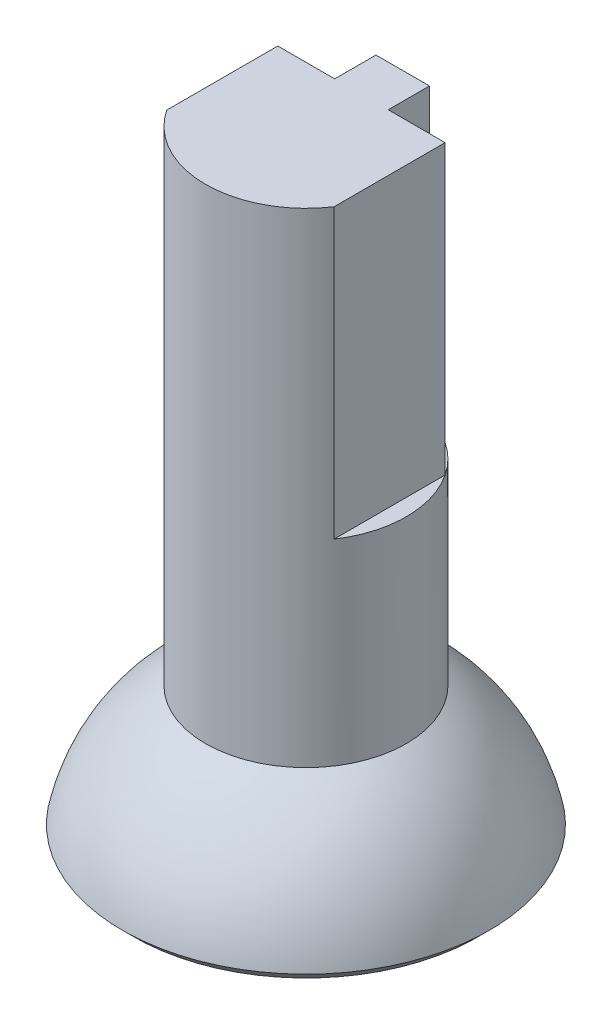
ISO-10303-21;
HEADER;
FILE_DESCRIPTION(('STEP AP214'),'2;1');
FILE_NAME('part.step','',(''),(''),'','','');
FILE_SCHEMA(('AUTOMOTIVE_DESIGN { 1 0 10303 214 1 1 1 1 }'));
ENDSEC;
DATA;
#1=APPLICATION_CONTEXT('core data for automotive mechanical design processes');
#2=APPLICATION_PROTOCOL_DEFINITION('international standard','automotive_design',2000,#1);
#3=PRODUCT_CONTEXT('',#1,'mechanical');
#4=PRODUCT('Part','Part','',(#3));
#5=PRODUCT_RELATED_PRODUCT_CATEGORY('part','',(#4));
#6=PRODUCT_DEFINITION_FORMATION('','',#4);
#7=PRODUCT_DEFINITION_CONTEXT('part definition',#1,'design');
#8=PRODUCT_DEFINITION('design','',#6,#7);
#9=PRODUCT_DEFINITION_SHAPE('','',#8);
#10=(LENGTH_UNIT() NAMED_UNIT(*) SI_UNIT(.MILLI.,.METRE.));
#11=(NAMED_UNIT(*) PLANE_ANGLE_UNIT() SI_UNIT($,.RADIAN.));
#12=(NAMED_UNIT(*) SI_UNIT($,.STERADIAN.) SOLID_ANGLE_UNIT());
#13=UNCERTAINTY_MEASURE_WITH_UNIT(LENGTH_MEASURE(1.E-05),#10,'distance_accuracy_value','');
#14=(GEOMETRIC_REPRESENTATION_CONTEXT(3) GLOBAL_UNCERTAINTY_ASSIGNED_CONTEXT((#13)) GLOBAL_UNIT_ASSIGNED_CONTEXT((#10,
#11,#12)) REPRESENTATION_CONTEXT('',''));
#15=CARTESIAN_POINT('',(0.,0.,0.));
#16=DIRECTION('',(0.,0.,1.));
#17=DIRECTION('',(1.,0.,0.));
#18=AXIS2_PLACEMENT_3D('',#15,#16,#17);
#19=CARTESIAN_POINT('',(0.,12.192,0.));
#20=DIRECTION('',(0.,-1.,0.));
#21=DIRECTION('',(1.,0.,0.));
#22=AXIS2_PLACEMENT_3D('',#19,#20,#21);
#23=PLANE('',#22);
#24=DIRECTION('',(0.,0.,1.));
#25=VECTOR('',#24,1.);
#26=CARTESIAN_POINT('',(-1.5875,12.192,0.));
#27=LINE('',#26,#25);
#28=CARTESIAN_POINT('',(-1.5875,12.192,-1.05302837093784));
#29=VERTEX_POINT('',#28);
#30=CARTESIAN_POINT('',(-1.5875,12.192,1.05302837093784));
#31=VERTEX_POINT('',#30);
#32=EDGE_CURVE('E248',#29,#31,#27,.T.);
#33=ORIENTED_EDGE('',*,*,#32,.T.);
#34=CARTESIAN_POINT('',(0.,12.192,0.));
#35=DIRECTION('',(0.,1.,0.));
#36=DIRECTION('',(-1.,0.,0.));
#37=AXIS2_PLACEMENT_3D('',#34,#35,#36);
#38=CIRCLE('',#37,1.905);
#39=CARTESIAN_POINT('',(1.5875,12.192,1.05302837093784));
#40=VERTEX_POINT('',#39);
#41=EDGE_CURVE('E228',#31,#40,#38,.T.);
#42=ORIENTED_EDGE('',*,*,#41,.T.);
#43=DIRECTION('',(0.,0.,1.));
#44=VECTOR('',#43,1.);
#45=CARTESIAN_POINT('',(1.5875,12.192,0.));
#46=LINE('',#45,#44);
#47=CARTESIAN_POINT('',(1.5875,12.192,-1.05302837093784));
#48=VERTEX_POINT('',#47);
#49=EDGE_CURVE('E245',#48,#40,#46,.T.);
#50=ORIENTED_EDGE('',*,*,#49,.F.);
#51=DIRECTION('',(1.,0.,0.));
#52=VECTOR('',#51,1.);
#53=CARTESIAN_POINT('',(0.,12.192,-1.05302837093784));
#54=LINE('',#53,#52);
#55=CARTESIAN_POINT('',(0.507999999999998,12.192,-1.05302837093784));
#56=VERTEX_POINT('',#55);
#57=EDGE_CURVE('E256',#56,#48,#54,.T.);
#58=ORIENTED_EDGE('',*,*,#57,.F.);
#59=DIRECTION('',(0.,0.,1.));
#60=VECTOR('',#59,1.);
#61=CARTESIAN_POINT('',(0.507999999999999,12.192,0.));
#62=LINE('',#61,#60);
#63=CARTESIAN_POINT('',(0.508,12.192,-1.83601770143972));
#64=VERTEX_POINT('',#63);
#65=EDGE_CURVE('E262',#64,#56,#62,.T.);
#66=ORIENTED_EDGE('',*,*,#65,.F.);
#67=DIRECTION('',(1.,0.,0.));
#68=VECTOR('',#67,1.);
#69=CARTESIAN_POINT('',(0.,12.192,-1.83601770143972));
#70=LINE('',#69,#68);
#71=CARTESIAN_POINT('',(-0.508,12.192,-1.83601770143972));
#72=VERTEX_POINT('',#71);
#73=EDGE_CURVE('E140',#72,#64,#70,.T.);
#74=ORIENTED_EDGE('',*,*,#73,.F.);
#75=DIRECTION('',(0.,0.,1.));
#76=VECTOR('',#75,1.);
#77=CARTESIAN_POINT('',(-0.508000000000001,12.192,0.));
#78=LINE('',#77,#76);
#79=CARTESIAN_POINT('',(-0.508000000000002,12.192,-1.05302837093784));
#80=VERTEX_POINT('',#79);
#81=EDGE_CURVE('E155',#72,#80,#78,.T.);
#82=ORIENTED_EDGE('',*,*,#81,.T.);
#83=DIRECTION('',(-1.,0.,0.));
#84=VECTOR('',#83,1.);
#85=CARTESIAN_POINT('',(0.,12.192,-1.05302837093784));
#86=LINE('',#85,#84);
#87=EDGE_CURVE('E260',#80,#29,#86,.T.);
#88=ORIENTED_EDGE('',*,*,#87,.T.);
#89=EDGE_LOOP('',(#33,#42,#50,#58,#66,#74,#82,#88));
#90=FACE_BOUND('',#89,.T.);
#91=ADVANCED_FACE('F49',(#90),#23,.F.);
#92=CARTESIAN_POINT('',(0.,12.192,0.));
#93=DIRECTION('',(0.,1.,0.));
#94=DIRECTION('',(-1.,0.,0.));
#95=AXIS2_PLACEMENT_3D('',#92,#93,#94);
#96=CYLINDRICAL_SURFACE('',#95,1.905);
#97=CARTESIAN_POINT('',(0.,3.00268396605437,0.));
#98=DIRECTION('',(0.,1.,0.));
#99=DIRECTION('',(-1.,0.,0.));
#100=AXIS2_PLACEMENT_3D('',#97,#98,#99);
#101=CIRCLE('',#100,1.905);
#102=CARTESIAN_POINT('',(-1.905,3.00268396605437,0.));
#103=VERTEX_POINT('',#102);
#104=EDGE_CURVE('E222',#103,#103,#101,.T.);
#105=ORIENTED_EDGE('',*,*,#104,.T.);
#106=EDGE_LOOP('',(#105));
#107=FACE_BOUND('',#106,.T.);
#108=ORIENTED_EDGE('',*,*,#41,.F.);
#109=DIRECTION('',(0.,1.,0.));
#110=VECTOR('',#109,1.);
#111=CARTESIAN_POINT('',(-1.5875,12.192,1.05302837093784));
#112=LINE('',#111,#110);
#113=CARTESIAN_POINT('',(-1.5875,6.731,1.05302837093784));
#114=VERTEX_POINT('',#113);
#115=EDGE_CURVE('E172',#31,#114,#112,.F.);
#116=ORIENTED_EDGE('',*,*,#115,.T.);
#117=CARTESIAN_POINT('',(0.,6.731,0.));
#118=DIRECTION('',(0.,1.,0.));
#119=DIRECTION('',(0.,0.,1.));
#120=AXIS2_PLACEMENT_3D('',#117,#118,#119);
#121=CIRCLE('',#120,1.905);
#122=CARTESIAN_POINT('',(-1.5875,6.731,-1.05302837093784));
#123=VERTEX_POINT('',#122);
#124=EDGE_CURVE('E163',#114,#123,#121,.F.);
#125=ORIENTED_EDGE('',*,*,#124,.T.);
#126=CARTESIAN_POINT('',(-0.507999999999999,6.731,-1.83601770143972));
#127=VERTEX_POINT('',#126);
#128=EDGE_CURVE('E160',#123,#127,#121,.F.);
#129=ORIENTED_EDGE('',*,*,#128,.T.);
#130=CARTESIAN_POINT('',(0.508000000000001,6.731,-1.83601770143972));
#131=VERTEX_POINT('',#130);
#132=EDGE_CURVE('E128',#127,#131,#121,.F.);
#133=ORIENTED_EDGE('',*,*,#132,.T.);
#134=CARTESIAN_POINT('',(1.5875,6.731,-1.05302837093784));
#135=VERTEX_POINT('',#134);
#136=EDGE_CURVE('E117',#131,#135,#121,.F.);
#137=ORIENTED_EDGE('',*,*,#136,.T.);
#138=CARTESIAN_POINT('',(1.5875,6.731,1.05302837093784));
#139=VERTEX_POINT('',#138);
#140=EDGE_CURVE('E129',#135,#139,#121,.F.);
#141=ORIENTED_EDGE('',*,*,#140,.T.);
#142=DIRECTION('',(0.,1.,0.));
#143=VECTOR('',#142,1.);
#144=CARTESIAN_POINT('',(1.5875,12.192,1.05302837093784));
#145=LINE('',#144,#143);
#146=EDGE_CURVE('E169',#40,#139,#145,.F.);
#147=ORIENTED_EDGE('',*,*,#146,.F.);
#148=EDGE_LOOP('',(#108,#116,#125,#129,#133,#137,#141,#147));
#149=FACE_BOUND('',#148,.T.);
#150=ADVANCED_FACE('F158',(#107,#149),#96,.T.);
#151=CARTESIAN_POINT('',(0.,0.508,0.));
#152=DIRECTION('',(0.,-1.,0.));
#153=DIRECTION('',(1.,0.,0.));
#154=AXIS2_PLACEMENT_3D('',#151,#152,#153);
#155=CONICAL_SURFACE('',#154,2.63964543073497,0.5235987755983);
#156=CARTESIAN_POINT('',(0.,1.27,0.));
#157=DIRECTION('',(0.,1.,0.));
#158=DIRECTION('',(-1.,0.,0.));
#159=AXIS2_PLACEMENT_3D('',#156,#157,#158);
#160=CIRCLE('',#159,2.19970452561247);
#161=CARTESIAN_POINT('',(-2.19970452561247,1.27,0.));
#162=VERTEX_POINT('',#161);
#163=EDGE_CURVE('E167',#162,#162,#160,.T.);
#164=ORIENTED_EDGE('',*,*,#163,.T.);
#165=EDGE_LOOP('',(#164));
#166=FACE_BOUND('',#165,.T.);
#167=CARTESIAN_POINT('',(0.,0.508,0.));
#168=DIRECTION('',(0.,1.,0.));
#169=DIRECTION('',(-1.,0.,0.));
#170=AXIS2_PLACEMENT_3D('',#167,#168,#169);
#171=CIRCLE('',#170,2.63964543073497);
#172=CARTESIAN_POINT('',(-2.63964543073497,0.507999999999999,0.));
#173=VERTEX_POINT('',#172);
#174=EDGE_CURVE('E219',#173,#173,#171,.T.);
#175=ORIENTED_EDGE('',*,*,#174,.F.);
#176=EDGE_LOOP('',(#175));
#177=FACE_BOUND('',#176,.T.);
#178=ADVANCED_FACE('F199',(#166,#177),#155,.F.);
#179=CARTESIAN_POINT('',(0.,0.,0.));
#180=DIRECTION('',(0.,1.,0.));
#181=DIRECTION('',(-1.,0.,0.));
#182=AXIS2_PLACEMENT_3D('',#179,#180,#181);
#183=SPHERICAL_SURFACE('',#182,2.54);
#184=CARTESIAN_POINT('',(0.,2.19970452561248,0.));
#185=DIRECTION('',(0.,1.,0.));
#186=DIRECTION('',(-1.,0.,0.));
#187=AXIS2_PLACEMENT_3D('',#184,#185,#186);
#188=CIRCLE('',#187,1.27);
#189=CARTESIAN_POINT('',(-1.27,2.19970452561248,0.));
#190=VERTEX_POINT('',#189);
#191=EDGE_CURVE('E236',#190,#190,#188,.T.);
#192=CARTESIAN_POINT('',(-1.27,2.19970452561248,0.));
#193=CARTESIAN_POINT('',(-1.28199753264214,2.19277775949318,0.));
#194=CARTESIAN_POINT('',(-1.29393838476726,2.18575282045622,0.));
#195=CARTESIAN_POINT('',(-1.31770355573429,2.17150851834517,0.));
#196=CARTESIAN_POINT('',(-1.3295278745762,2.16428915527108,0.));
#197=CARTESIAN_POINT('',(-1.35305680672766,2.14965792688395,0.));
#198=CARTESIAN_POINT('',(-1.3647614200372,2.1422460615709,0.));
#199=CARTESIAN_POINT('',(-1.38804780928253,2.12723181598885,0.));
#200=CARTESIAN_POINT('',(-1.39962958521831,2.11962943571983,0.));
#201=CARTESIAN_POINT('',(-1.42266719852126,2.1042361947771,0.));
#202=CARTESIAN_POINT('',(-1.43412303588844,2.09644533410339,0.));
#203=CARTESIAN_POINT('',(-1.45690570517635,2.08067721836467,0.));
#204=CARTESIAN_POINT('',(-1.46823253709709,2.07269996329967,0.));
#205=CARTESIAN_POINT('',(-1.49075416299134,2.05656119442574,0.));
#206=CARTESIAN_POINT('',(-1.50194895696485,2.04839968061682,0.));
#207=CARTESIAN_POINT('',(-1.52420350985671,2.03189457930486,0.));
#208=CARTESIAN_POINT('',(-1.53526326877505,2.02355099180182,0.));
#209=CARTESIAN_POINT('',(-1.55724479058924,2.00668397687767,0.));
#210=CARTESIAN_POINT('',(-1.56816655348509,1.99816054945656,0.));
#211=CARTESIAN_POINT('',(-1.5898691592349,1.98093613662499,0.));
#212=CARTESIAN_POINT('',(-1.60065000208887,1.97223515121454,0.));
#213=CARTESIAN_POINT('',(-1.62206788146244,1.95465795186817,0.));
#214=CARTESIAN_POINT('',(-1.63270491798204,1.94578173793227,0.));
#215=CARTESIAN_POINT('',(-1.65383233689503,1.92785645791219,0.));
#216=CARTESIAN_POINT('',(-1.66432271928842,1.91880739182802,0.));
#217=CARTESIAN_POINT('',(-1.68515402141993,1.90053883016519,0.));
#218=CARTESIAN_POINT('',(-1.69549494115806,1.89131933458654,0.));
#219=CARTESIAN_POINT('',(-1.71602454946479,1.87271238221666,0.));
#220=CARTESIAN_POINT('',(-1.7262132380334,1.86332492542543,0.));
#221=CARTESIAN_POINT('',(-1.74643565624278,1.84438456387958,0.));
#222=CARTESIAN_POINT('',(-1.75646938588357,1.83483165912496,0.));
#223=CARTESIAN_POINT('',(-1.77637919996526,1.81556295919592,0.));
#224=CARTESIAN_POINT('',(-1.78625528440617,1.8058471640215,0.));
#225=CARTESIAN_POINT('',(-1.80584716402149,1.78625528440617,0.));
#226=CARTESIAN_POINT('',(-1.81556295919591,1.77637919996526,0.));
#227=CARTESIAN_POINT('',(-1.83483165912495,1.75646938588357,0.));
#228=CARTESIAN_POINT('',(-1.84438456387958,1.74643565624279,0.));
#229=CARTESIAN_POINT('',(-1.86332492542543,1.7262132380334,0.));
#230=CARTESIAN_POINT('',(-1.87271238221665,1.7160245494648,0.));
#231=CARTESIAN_POINT('',(-1.89131933458653,1.69549494115806,0.));
#232=CARTESIAN_POINT('',(-1.90053883016519,1.68515402141993,0.));
#233=CARTESIAN_POINT('',(-1.91880739182801,1.66432271928842,0.));
#234=CARTESIAN_POINT('',(-1.92785645791219,1.65383233689503,0.));
#235=CARTESIAN_POINT('',(-1.94578173793226,1.63270491798205,0.));
#236=CARTESIAN_POINT('',(-1.95465795186817,1.62206788146245,0.));
#237=CARTESIAN_POINT('',(-1.97223515121453,1.60065000208888,0.));
#238=CARTESIAN_POINT('',(-1.98093613662499,1.58986915923491,0.));
#239=CARTESIAN_POINT('',(-1.99816054945655,1.56816655348509,0.));
#240=CARTESIAN_POINT('',(-2.00668397687766,1.55724479058925,0.));
#241=CARTESIAN_POINT('',(-2.02355099180181,1.53526326877506,0.));
#242=CARTESIAN_POINT('',(-2.03189457930486,1.52420350985671,0.));
#243=CARTESIAN_POINT('',(-2.04839968061682,1.50194895696485,0.));
#244=CARTESIAN_POINT('',(-2.05656119442574,1.49075416299134,0.));
#245=CARTESIAN_POINT('',(-2.07269996329966,1.4682325370971,0.));
#246=CARTESIAN_POINT('',(-2.08067721836467,1.45690570517636,0.));
#247=CARTESIAN_POINT('',(-2.09644533410339,1.43412303588845,0.));
#248=CARTESIAN_POINT('',(-2.1042361947771,1.42266719852127,0.));
#249=CARTESIAN_POINT('',(-2.11962943571983,1.39962958521831,0.));
#250=CARTESIAN_POINT('',(-2.12723181598884,1.38804780928253,0.));
#251=CARTESIAN_POINT('',(-2.1422460615709,1.36476142003721,0.));
#252=CARTESIAN_POINT('',(-2.14965792688394,1.35305680672766,0.));
#253=CARTESIAN_POINT('',(-2.16428915527108,1.32952787457621,0.));
#254=CARTESIAN_POINT('',(-2.17150851834517,1.3177035557343,0.));
#255=CARTESIAN_POINT('',(-2.18575282045621,1.29393838476727,0.));
#256=CARTESIAN_POINT('',(-2.19277775949317,1.28199753264215,0.));
#257=CARTESIAN_POINT('',(-2.19970452561247,1.27,0.));
#258=B_SPLINE_CURVE_WITH_KNOTS('',3,(#192,#193,#194,#195,#196,#197,#198,#199,#200,#201,#202,
#203,#204,#205,#206,#207,#208,#209,#210,#211,#212,#213,#214,#215,#216,#217,#218,#219,#220,#221,
#222,#223,#224,#225,#226,#227,#228,#229,#230,#231,#232,#233,#234,#235,#236,#237,#238,#239,#240,
#241,#242,#243,#244,#245,#246,#247,#248,#249,#250,#251,#252,#253,#254,#255,#256,#257),
.UNSPECIFIED.,.F.,.F.,(4,2,2,2,2,2,2,2,2,2,2,2,2,2,2,2,2,2,2,2,2,2,2,2,2,2,2,2,2,2,2,2,4),(0.,
0.0415601891880008,0.0831203783760017,0.124680567564002,0.166240756752003,0.207800945940004,
0.249361135128005,0.290921324316005,0.332481513504006,0.374041702692006,0.415601891880008,
0.457162081068008,0.498722270256009,0.54028245944401,0.581842648632011,0.623402837820011,
0.664963027008012,0.706523216196013,0.748083405384014,0.789643594572014,0.831203783760015,
0.872763972948016,0.914324162136017,0.955884351324017,0.997444540512018,1.03900472970002,
1.08056491888802,1.12212510807602,1.16368529726402,1.20524548645202,1.24680567564002,
1.28836586482802,1.32992605401602),.UNSPECIFIED.);
#259=EDGE_CURVE('BSEAM207',#190,#162,#258,.T.);
#260=ORIENTED_EDGE('',*,*,#191,.T.);
#261=ORIENTED_EDGE('',*,*,#163,.F.);
#262=ORIENTED_EDGE('',*,*,#259,.T.);
#263=ORIENTED_EDGE('',*,*,#259,.F.);
#264=EDGE_LOOP('',(#260,#262,#261,#263));
#265=FACE_BOUND('',#264,.T.);
#266=ADVANCED_FACE('F207',(#265),#183,.F.);
#267=CARTESIAN_POINT('',(0.,2.19970452561248,0.));
#268=DIRECTION('',(0.,-1.,0.));
#269=DIRECTION('',(1.,0.,0.));
#270=AXIS2_PLACEMENT_3D('',#267,#268,#269);
#271=CONICAL_SURFACE('',#270,1.27,1.0471975511966);
#272=CARTESIAN_POINT('',(0.,2.9329393674833,0.));
#273=VERTEX_POINT('',#272);
#274=VERTEX_LOOP('',#273);
#275=FACE_BOUND('',#274,.T.);
#276=ORIENTED_EDGE('',*,*,#191,.F.);
#277=EDGE_LOOP('',(#276));
#278=FACE_BOUND('',#277,.T.);
#279=ADVANCED_FACE('F205',(#275,#278),#271,.F.);
#280=CARTESIAN_POINT('',(0.,0.,0.));
#281=DIRECTION('',(0.,1.,0.));
#282=DIRECTION('',(-1.,0.,0.));
#283=AXIS2_PLACEMENT_3D('',#280,#281,#282);
#284=SPHERICAL_SURFACE('',#283,3.556);
#285=CARTESIAN_POINT('',(0.,0.723991448179065,0.));
#286=DIRECTION('',(0.,-1.,0.));
#287=DIRECTION('',(1.,0.,0.));
#288=AXIS2_PLACEMENT_3D('',#285,#286,#287);
#289=CIRCLE('',#288,3.48151868915903);
#290=CARTESIAN_POINT('',(-3.48151868915903,0.723991448179064,0.));
#291=VERTEX_POINT('',#290);
#292=EDGE_CURVE('E59',#291,#291,#289,.F.);
#293=CARTESIAN_POINT('',(-3.48151868915903,0.723991448179064,0.));
#294=CARTESIAN_POINT('',(-3.4754823990545,0.753019074161947,0.));
#295=CARTESIAN_POINT('',(-3.46908291744924,0.78197116978079,0.));
#296=CARTESIAN_POINT('',(-3.45556193107731,0.83970627094987,0.));
#297=CARTESIAN_POINT('',(-3.44844042631065,0.868489276500107,0.));
#298=CARTESIAN_POINT('',(-3.43347975345604,0.925868168191444,0.));
#299=CARTESIAN_POINT('',(-3.42564058536809,0.954464054332545,0.));
#300=CARTESIAN_POINT('',(-3.40924951572387,1.01145082327411,0.));
#301=CARTESIAN_POINT('',(-3.4006976141676,1.03984170607458,0.));
#302=CARTESIAN_POINT('',(-3.38288642090311,1.09640070506086,0.));
#303=CARTESIAN_POINT('',(-3.37362712919488,1.12456882124668,0.));
#304=CARTESIAN_POINT('',(-3.35440695018425,1.18066466513013,0.));
#305=CARTESIAN_POINT('',(-3.34444606288185,1.20859239282777,0.));
#306=CARTESIAN_POINT('',(-3.32382892383864,1.2641899877059,0.));
#307=CARTESIAN_POINT('',(-3.31317267209784,1.29185985488639,0.));
#308=CARTESIAN_POINT('',(-3.29117147098565,1.34692441816792,0.));
#309=CARTESIAN_POINT('',(-3.27982652161426,1.37431911426896,0.));
#310=CARTESIAN_POINT('',(-3.25645502273886,1.4288161969404,0.));
#311=CARTESIAN_POINT('',(-3.24442847323484,1.45591858351079,0.));
#312=CARTESIAN_POINT('',(-3.21970129805395,1.50981409155249,0.));
#313=CARTESIAN_POINT('',(-3.20700067237707,1.5366072130238,0.));
#314=CARTESIAN_POINT('',(-3.1809332905082,1.58986742877595,0.));
#315=CARTESIAN_POINT('',(-3.1675665343162,1.61633452305679,0.));
#316=CARTESIAN_POINT('',(-3.14017525381707,1.66892612630382,0.));
#317=CARTESIAN_POINT('',(-3.12615072950995,1.69505063527,0.));
#318=CARTESIAN_POINT('',(-3.09745268668715,1.74694072408869,0.));
#319=CARTESIAN_POINT('',(-3.08277916817148,1.7727063039412,0.));
#320=CARTESIAN_POINT('',(-3.05279231685678,1.82386241528386,0.));
#321=CARTESIAN_POINT('',(-3.03747898405775,1.849252946774,0.));
#322=CARTESIAN_POINT('',(-3.0062220843768,1.89964307677787,0.));
#323=CARTESIAN_POINT('',(-2.99027851749487,1.92464267529159,0.));
#324=CARTESIAN_POINT('',(-2.95777112413039,1.9742352993008,0.));
#325=CARTESIAN_POINT('',(-2.94120729764784,1.99882832479629,0.));
#326=CARTESIAN_POINT('',(-2.9074697476061,2.04759241708408,0.));
#327=CARTESIAN_POINT('',(-2.89029602404689,2.07176348387638,0.));
#328=CARTESIAN_POINT('',(-2.85534942393455,2.11966853705514,0.));
#329=CARTESIAN_POINT('',(-2.83757654738142,2.1434025234416,0.));
#330=CARTESIAN_POINT('',(-2.80144276020106,2.19041856754866,0.));
#331=CARTESIAN_POINT('',(-2.78308184957385,2.21370062526925,0.));
#332=CARTESIAN_POINT('',(-2.7457834810462,2.25979824651642,0.));
#333=CARTESIAN_POINT('',(-2.72684602314577,2.282613810043,0.));
#334=CARTESIAN_POINT('',(-2.68840640756727,2.32776416921819,0.));
#335=CARTESIAN_POINT('',(-2.6689042498892,2.35009896486679,0.));
#336=CARTESIAN_POINT('',(-2.6293474355339,2.39427381537627,0.));
#337=CARTESIAN_POINT('',(-2.60929277885668,2.41611387023715,0.));
#338=CARTESIAN_POINT('',(-2.56864351293095,2.45928557577633,0.));
#339=CARTESIAN_POINT('',(-2.54804890368243,2.48061722645464,0.));
#340=CARTESIAN_POINT('',(-2.50633261684445,2.52275877830019,0.));
#341=CARTESIAN_POINT('',(-2.48521093925499,2.54356867946743,0.));
#342=CARTESIAN_POINT('',(-2.44245372969873,2.58465371336473,0.));
#343=CARTESIAN_POINT('',(-2.42081819773194,2.60492884609479,0.));
#344=CARTESIAN_POINT('',(-2.37704681488356,2.64493165878723,0.));
#345=CARTESIAN_POINT('',(-2.35491096400198,2.6646593387496,0.));
#346=CARTESIAN_POINT('',(-2.31015279169639,2.70355490392639,0.));
#347=CARTESIAN_POINT('',(-2.28753047027237,2.72272278914081,0.));
#348=CARTESIAN_POINT('',(-2.24181350995262,2.7604867735879,0.));
#349=CARTESIAN_POINT('',(-2.21871887105689,2.77908287282058,0.));
#350=CARTESIAN_POINT('',(-2.17207172302053,2.81569164979973,0.));
#351=CARTESIAN_POINT('',(-2.14851921387991,2.83370432754622,0.));
#352=CARTESIAN_POINT('',(-2.10097106399784,2.8691349984582,0.));
#353=CARTESIAN_POINT('',(-2.07697542325639,2.88655299162369,0.));
#354=CARTESIAN_POINT('',(-2.02855600750334,2.92078337464992,0.));
#355=CARTESIAN_POINT('',(-2.00413223249174,2.93759576451066,0.));
#356=CARTESIAN_POINT('',(-1.95487188257344,2.97060450434423,0.));
#357=CARTESIAN_POINT('',(-1.93003530766674,2.98680085431706,0.));
#358=CARTESIAN_POINT('',(-1.905,3.00268396605437,0.));
#359=B_SPLINE_CURVE_WITH_KNOTS('',3,(#293,#294,#295,#296,#297,#298,#299,#300,#301,#302,#303,
#304,#305,#306,#307,#308,#309,#310,#311,#312,#313,#314,#315,#316,#317,#318,#319,#320,#321,#322,
#323,#324,#325,#326,#327,#328,#329,#330,#331,#332,#333,#334,#335,#336,#337,#338,#339,#340,#341,
#342,#343,#344,#345,#346,#347,#348,#349,#350,#351,#352,#353,#354,#355,#356,#357,#358),
.UNSPECIFIED.,.F.,.F.,(4,2,2,2,2,2,2,2,2,2,2,2,2,2,2,2,2,2,2,2,2,2,2,2,2,2,2,2,2,2,2,2,4),(0.,
0.0889434948275767,0.177886989655154,0.26683048448273,0.355773979310307,0.444717474137884,
0.53366096896546,0.622604463793037,0.711547958620614,0.800491453448191,0.889434948275767,
0.978378443103344,1.06732193793092,1.1562654327585,1.24520892758607,1.33415242241365,
1.42309591724123,1.5120394120688,1.60098290689638,1.68992640172396,1.77886989655153,
1.86781339137911,1.95675688620669,2.04570038103427,2.13464387586184,2.22358737068942,
2.312530865517,2.40147436034457,2.49041785517215,2.57936134999973,2.6683048448273,
2.75724833965488,2.84619183448246),.UNSPECIFIED.);
#360=EDGE_CURVE('BSEAM179',#291,#103,#359,.T.);
#361=ORIENTED_EDGE('',*,*,#292,.T.);
#362=ORIENTED_EDGE('',*,*,#104,.F.);
#363=ORIENTED_EDGE('',*,*,#360,.T.);
#364=ORIENTED_EDGE('',*,*,#360,.F.);
#365=EDGE_LOOP('',(#361,#363,#362,#364));
#366=FACE_BOUND('',#365,.T.);
#367=ADVANCED_FACE('F179',(#366),#284,.T.);
#368=CARTESIAN_POINT('',(0.,0.508,0.));
#369=DIRECTION('',(0.,-1.,0.));
#370=DIRECTION('',(1.,0.,0.));
#371=AXIS2_PLACEMENT_3D('',#368,#369,#370);
#372=PLANE('',#371);
#373=CARTESIAN_POINT('',(0.,0.508,0.));
#374=DIRECTION('',(0.,-1.,0.));
#375=DIRECTION('',(1.,0.,0.));
#376=AXIS2_PLACEMENT_3D('',#373,#374,#375);
#377=CIRCLE('',#376,3.26552724097996);
#378=CARTESIAN_POINT('',(-3.26552724097996,0.507999999999999,0.));
#379=VERTEX_POINT('',#378);
#380=EDGE_CURVE('E11',#379,#379,#377,.T.);
#381=ORIENTED_EDGE('',*,*,#380,.T.);
#382=EDGE_LOOP('',(#381));
#383=FACE_BOUND('',#382,.T.);
#384=ORIENTED_EDGE('',*,*,#174,.T.);
#385=EDGE_LOOP('',(#384));
#386=FACE_BOUND('',#385,.T.);
#387=ADVANCED_FACE('F305',(#383,#386),#372,.T.);
#388=CARTESIAN_POINT('',(0.,6.731,0.));
#389=DIRECTION('',(0.,1.,0.));
#390=DIRECTION('',(0.,0.,1.));
#391=AXIS2_PLACEMENT_3D('',#388,#389,#390);
#392=PLANE('',#391);
#393=DIRECTION('',(0.,0.,1.));
#394=VECTOR('',#393,1.);
#395=CARTESIAN_POINT('',(-1.5875,6.731,0.));
#396=LINE('',#395,#394);
#397=EDGE_CURVE('E290',#123,#114,#396,.T.);
#398=ORIENTED_EDGE('',*,*,#397,.F.);
#399=ORIENTED_EDGE('',*,*,#124,.F.);
#400=EDGE_LOOP('',(#398,#399));
#401=FACE_BOUND('',#400,.T.);
#402=ADVANCED_FACE('F190',(#401),#392,.T.);
#403=DIRECTION('',(-1.,0.,0.));
#404=VECTOR('',#403,1.);
#405=CARTESIAN_POINT('',(0.,6.731,-1.05302837093784));
#406=LINE('',#405,#404);
#407=CARTESIAN_POINT('',(-0.508000000000001,6.731,-1.05302837093784));
#408=VERTEX_POINT('',#407);
#409=EDGE_CURVE('E286',#408,#123,#406,.T.);
#410=ORIENTED_EDGE('',*,*,#409,.F.);
#411=DIRECTION('',(0.,0.,1.));
#412=VECTOR('',#411,1.);
#413=CARTESIAN_POINT('',(-0.508000000000001,6.731,0.));
#414=LINE('',#413,#412);
#415=EDGE_CURVE('E146',#127,#408,#414,.T.);
#416=ORIENTED_EDGE('',*,*,#415,.F.);
#417=ORIENTED_EDGE('',*,*,#128,.F.);
#418=EDGE_LOOP('',(#410,#416,#417));
#419=FACE_BOUND('',#418,.T.);
#420=ADVANCED_FACE('F304',(#419),#392,.T.);
#421=DIRECTION('',(1.,0.,0.));
#422=VECTOR('',#421,1.);
#423=CARTESIAN_POINT('',(0.,6.731,-1.83601770143972));
#424=LINE('',#423,#422);
#425=EDGE_CURVE('E137',#127,#131,#424,.T.);
#426=ORIENTED_EDGE('',*,*,#425,.T.);
#427=ORIENTED_EDGE('',*,*,#132,.F.);
#428=EDGE_LOOP('',(#426,#427));
#429=FACE_BOUND('',#428,.T.);
#430=ADVANCED_FACE('F152',(#429),#392,.T.);
#431=DIRECTION('',(0.,0.,1.));
#432=VECTOR('',#431,1.);
#433=CARTESIAN_POINT('',(0.507999999999999,6.731,0.));
#434=LINE('',#433,#432);
#435=CARTESIAN_POINT('',(0.507999999999999,6.731,-1.05302837093784));
#436=VERTEX_POINT('',#435);
#437=EDGE_CURVE('E121',#131,#436,#434,.T.);
#438=ORIENTED_EDGE('',*,*,#437,.T.);
#439=DIRECTION('',(1.,0.,0.));
#440=VECTOR('',#439,1.);
#441=CARTESIAN_POINT('',(0.,6.731,-1.05302837093784));
#442=LINE('',#441,#440);
#443=EDGE_CURVE('E123',#436,#135,#442,.T.);
#444=ORIENTED_EDGE('',*,*,#443,.T.);
#445=ORIENTED_EDGE('',*,*,#136,.F.);
#446=EDGE_LOOP('',(#438,#444,#445));
#447=FACE_BOUND('',#446,.T.);
#448=ADVANCED_FACE('F119',(#447),#392,.T.);
#449=CARTESIAN_POINT('',(0.,6.731,-1.83601770143972));
#450=DIRECTION('',(0.,0.,1.));
#451=DIRECTION('',(1.,0.,0.));
#452=AXIS2_PLACEMENT_3D('',#449,#450,#451);
#453=PLANE('',#452);
#454=ORIENTED_EDGE('',*,*,#73,.T.);
#455=DIRECTION('',(0.,1.,0.));
#456=VECTOR('',#455,1.);
#457=CARTESIAN_POINT('',(0.508000000000001,6.731,-1.83601770143972));
#458=LINE('',#457,#456);
#459=EDGE_CURVE('E134',#131,#64,#458,.T.);
#460=ORIENTED_EDGE('',*,*,#459,.F.);
#461=ORIENTED_EDGE('',*,*,#425,.F.);
#462=DIRECTION('',(0.,1.,0.));
#463=VECTOR('',#462,1.);
#464=CARTESIAN_POINT('',(-0.507999999999999,6.731,-1.83601770143972));
#465=LINE('',#464,#463);
#466=EDGE_CURVE('E223',#127,#72,#465,.T.);
#467=ORIENTED_EDGE('',*,*,#466,.T.);
#468=EDGE_LOOP('',(#454,#460,#461,#467));
#469=FACE_BOUND('',#468,.T.);
#470=ADVANCED_FACE('F135',(#469),#453,.F.);
#471=CARTESIAN_POINT('',(-0.508000000000001,6.731,0.));
#472=DIRECTION('',(-1.,0.,0.));
#473=DIRECTION('',(0.,0.,1.));
#474=AXIS2_PLACEMENT_3D('',#471,#472,#473);
#475=PLANE('',#474);
#476=ORIENTED_EDGE('',*,*,#81,.F.);
#477=ORIENTED_EDGE('',*,*,#466,.F.);
#478=ORIENTED_EDGE('',*,*,#415,.T.);
#479=DIRECTION('',(0.,1.,0.));
#480=VECTOR('',#479,1.);
#481=CARTESIAN_POINT('',(-0.508000000000001,6.731,-1.05302837093784));
#482=LINE('',#481,#480);
#483=EDGE_CURVE('E230',#408,#80,#482,.T.);
#484=ORIENTED_EDGE('',*,*,#483,.T.);
#485=EDGE_LOOP('',(#476,#477,#478,#484));
#486=FACE_BOUND('',#485,.T.);
#487=ADVANCED_FACE('F313',(#486),#475,.T.);
#488=CARTESIAN_POINT('',(0.,6.731,-1.05302837093784));
#489=DIRECTION('',(0.,0.,-1.));
#490=DIRECTION('',(-1.,0.,0.));
#491=AXIS2_PLACEMENT_3D('',#488,#489,#490);
#492=PLANE('',#491);
#493=ORIENTED_EDGE('',*,*,#87,.F.);
#494=ORIENTED_EDGE('',*,*,#483,.F.);
#495=ORIENTED_EDGE('',*,*,#409,.T.);
#496=DIRECTION('',(0.,1.,0.));
#497=VECTOR('',#496,1.);
#498=CARTESIAN_POINT('',(-1.5875,6.731,-1.05302837093784));
#499=LINE('',#498,#497);
#500=EDGE_CURVE('E273',#123,#29,#499,.T.);
#501=ORIENTED_EDGE('',*,*,#500,.T.);
#502=EDGE_LOOP('',(#493,#494,#495,#501));
#503=FACE_BOUND('',#502,.T.);
#504=ADVANCED_FACE('F316',(#503),#492,.T.);
#505=CARTESIAN_POINT('',(-1.5875,6.731,0.));
#506=DIRECTION('',(-1.,0.,0.));
#507=DIRECTION('',(0.,-1.,0.));
#508=AXIS2_PLACEMENT_3D('',#505,#506,#507);
#509=PLANE('',#508);
#510=ORIENTED_EDGE('',*,*,#32,.F.);
#511=ORIENTED_EDGE('',*,*,#500,.F.);
#512=ORIENTED_EDGE('',*,*,#397,.T.);
#513=ORIENTED_EDGE('',*,*,#115,.F.);
#514=EDGE_LOOP('',(#510,#511,#512,#513));
#515=FACE_BOUND('',#514,.T.);
#516=ADVANCED_FACE('F300',(#515),#509,.T.);
#517=CARTESIAN_POINT('',(1.5875,6.731,0.));
#518=DIRECTION('',(-1.,0.,0.));
#519=DIRECTION('',(0.,-1.,0.));
#520=AXIS2_PLACEMENT_3D('',#517,#518,#519);
#521=PLANE('',#520);
#522=ORIENTED_EDGE('',*,*,#146,.T.);
#523=DIRECTION('',(0.,0.,1.));
#524=VECTOR('',#523,1.);
#525=CARTESIAN_POINT('',(1.5875,6.731,0.));
#526=LINE('',#525,#524);
#527=EDGE_CURVE('E65',#135,#139,#526,.T.);
#528=ORIENTED_EDGE('',*,*,#527,.F.);
#529=DIRECTION('',(0.,1.,0.));
#530=VECTOR('',#529,1.);
#531=CARTESIAN_POINT('',(1.5875,6.731,-1.05302837093784));
#532=LINE('',#531,#530);
#533=EDGE_CURVE('E253',#135,#48,#532,.T.);
#534=ORIENTED_EDGE('',*,*,#533,.T.);
#535=ORIENTED_EDGE('',*,*,#49,.T.);
#536=EDGE_LOOP('',(#522,#528,#534,#535));
#537=FACE_BOUND('',#536,.T.);
#538=ADVANCED_FACE('F251',(#537),#521,.F.);
#539=CARTESIAN_POINT('',(0.,6.731,-1.05302837093784));
#540=DIRECTION('',(0.,0.,1.));
#541=DIRECTION('',(1.,0.,0.));
#542=AXIS2_PLACEMENT_3D('',#539,#540,#541);
#543=PLANE('',#542);
#544=ORIENTED_EDGE('',*,*,#57,.T.);
#545=ORIENTED_EDGE('',*,*,#533,.F.);
#546=ORIENTED_EDGE('',*,*,#443,.F.);
#547=DIRECTION('',(0.,1.,0.));
#548=VECTOR('',#547,1.);
#549=CARTESIAN_POINT('',(0.507999999999999,6.731,-1.05302837093784));
#550=LINE('',#549,#548);
#551=EDGE_CURVE('E145',#436,#56,#550,.T.);
#552=ORIENTED_EDGE('',*,*,#551,.T.);
#553=EDGE_LOOP('',(#544,#545,#546,#552));
#554=FACE_BOUND('',#553,.T.);
#555=ADVANCED_FACE('F279',(#554),#543,.F.);
#556=CARTESIAN_POINT('',(0.507999999999999,6.731,0.));
#557=DIRECTION('',(-1.,0.,0.));
#558=DIRECTION('',(0.,0.,1.));
#559=AXIS2_PLACEMENT_3D('',#556,#557,#558);
#560=PLANE('',#559);
#561=ORIENTED_EDGE('',*,*,#65,.T.);
#562=ORIENTED_EDGE('',*,*,#551,.F.);
#563=ORIENTED_EDGE('',*,*,#437,.F.);
#564=ORIENTED_EDGE('',*,*,#459,.T.);
#565=EDGE_LOOP('',(#561,#562,#563,#564));
#566=FACE_BOUND('',#565,.T.);
#567=ADVANCED_FACE('F148',(#566),#560,.F.);
#568=ORIENTED_EDGE('',*,*,#527,.T.);
#569=ORIENTED_EDGE('',*,*,#140,.F.);
#570=EDGE_LOOP('',(#568,#569));
#571=FACE_BOUND('',#570,.T.);
#572=ADVANCED_FACE('F183',(#571),#392,.T.);
#573=CARTESIAN_POINT('',(0.,0.723991448179065,0.));
#574=DIRECTION('',(0.,1.,0.));
#575=DIRECTION('',(-1.,0.,0.));
#576=AXIS2_PLACEMENT_3D('',#573,#574,#575);
#577=CONICAL_SURFACE('',#576,3.48151868915903,0.785398163397454);
#578=CARTESIAN_POINT('',(-3.26552724097996,0.507999999999999,0.));
#579=CARTESIAN_POINT('',(-3.26777715189849,0.510249910918532,0.));
#580=CARTESIAN_POINT('',(-3.27002706281702,0.512499821837063,0.));
#581=CARTESIAN_POINT('',(-3.27452688465409,0.516999643674127,0.));
#582=CARTESIAN_POINT('',(-3.27677679557262,0.519249554592659,0.));
#583=CARTESIAN_POINT('',(-3.28127661740968,0.523749376429723,0.));
#584=CARTESIAN_POINT('',(-3.28352652832821,0.525999287348255,0.));
#585=CARTESIAN_POINT('',(-3.28802635016528,0.530499109185319,0.));
#586=CARTESIAN_POINT('',(-3.29027626108381,0.532749020103851,0.));
#587=CARTESIAN_POINT('',(-3.29477608292087,0.537248841940914,0.));
#588=CARTESIAN_POINT('',(-3.29702599383941,0.539498752859446,0.));
#589=CARTESIAN_POINT('',(-3.30152581567647,0.54399857469651,0.));
#590=CARTESIAN_POINT('',(-3.303775726595,0.546248485615042,0.));
#591=CARTESIAN_POINT('',(-3.30827554843207,0.550748307452106,0.));
#592=CARTESIAN_POINT('',(-3.3105254593506,0.552998218370638,0.));
#593=CARTESIAN_POINT('',(-3.31502528118766,0.557498040207702,0.));
#594=CARTESIAN_POINT('',(-3.31727519210619,0.559747951126234,0.));
#595=CARTESIAN_POINT('',(-3.32177501394326,0.564247772963298,0.));
#596=CARTESIAN_POINT('',(-3.32402492486179,0.56649768388183,0.));
#597=CARTESIAN_POINT('',(-3.32852474669885,0.570997505718893,0.));
#598=CARTESIAN_POINT('',(-3.33077465761738,0.573247416637425,0.));
#599=CARTESIAN_POINT('',(-3.33527447945445,0.577747238474489,0.));
#600=CARTESIAN_POINT('',(-3.33752439037298,0.579997149393021,0.));
#601=CARTESIAN_POINT('',(-3.34202421221004,0.584496971230085,0.));
#602=CARTESIAN_POINT('',(-3.34427412312858,0.586746882148617,0.));
#603=CARTESIAN_POINT('',(-3.34877394496564,0.591246703985681,0.));
#604=CARTESIAN_POINT('',(-3.35102385588417,0.593496614904213,0.));
#605=CARTESIAN_POINT('',(-3.35552367772124,0.597996436741277,0.));
#606=CARTESIAN_POINT('',(-3.35777358863977,0.600246347659808,0.));
#607=CARTESIAN_POINT('',(-3.36227341047683,0.604746169496872,0.));
#608=CARTESIAN_POINT('',(-3.36452332139536,0.606996080415404,0.));
#609=CARTESIAN_POINT('',(-3.36902314323243,0.611495902252468,0.));
#610=CARTESIAN_POINT('',(-3.37127305415096,0.613745813171,0.));
#611=CARTESIAN_POINT('',(-3.37577287598802,0.618245635008064,0.));
#612=CARTESIAN_POINT('',(-3.37802278690656,0.620495545926596,0.));
#613=CARTESIAN_POINT('',(-3.38252260874362,0.62499536776366,0.));
#614=CARTESIAN_POINT('',(-3.38477251966215,0.627245278682192,0.));
#615=CARTESIAN_POINT('',(-3.38927234149922,0.631745100519256,0.));
#616=CARTESIAN_POINT('',(-3.39152225241775,0.633995011437787,0.));
#617=CARTESIAN_POINT('',(-3.39602207425481,0.638494833274851,0.));
#618=CARTESIAN_POINT('',(-3.39827198517334,0.640744744193383,0.));
#619=CARTESIAN_POINT('',(-3.40277180701041,0.645244566030447,0.));
#620=CARTESIAN_POINT('',(-3.40502171792894,0.647494476948979,0.));
#621=CARTESIAN_POINT('',(-3.409521539766,0.651994298786043,0.));
#622=CARTESIAN_POINT('',(-3.41177145068453,0.654244209704575,0.));
#623=CARTESIAN_POINT('',(-3.4162712725216,0.658744031541639,0.));
#624=CARTESIAN_POINT('',(-3.41852118344013,0.660993942460171,0.));
#625=CARTESIAN_POINT('',(-3.42302100527719,0.665493764297234,0.));
#626=CARTESIAN_POINT('',(-3.42527091619573,0.667743675215766,0.));
#627=CARTESIAN_POINT('',(-3.42977073803279,0.67224349705283,0.));
#628=CARTESIAN_POINT('',(-3.43202064895132,0.674493407971362,0.));
#629=CARTESIAN_POINT('',(-3.43652047078839,0.678993229808426,0.));
#630=CARTESIAN_POINT('',(-3.43877038170692,0.681243140726958,0.));
#631=CARTESIAN_POINT('',(-3.44327020354398,0.685742962564022,0.));
#632=CARTESIAN_POINT('',(-3.44552011446251,0.687992873482554,0.));
#633=CARTESIAN_POINT('',(-3.45001993629958,0.692492695319617,0.));
#634=CARTESIAN_POINT('',(-3.45226984721811,0.694742606238149,0.));
#635=CARTESIAN_POINT('',(-3.45676966905517,0.699242428075213,0.));
#636=CARTESIAN_POINT('',(-3.45901957997371,0.701492338993745,0.));
#637=CARTESIAN_POINT('',(-3.46351940181077,0.705992160830809,0.));
#638=CARTESIAN_POINT('',(-3.4657693127293,0.708242071749341,0.));
#639=CARTESIAN_POINT('',(-3.47026913456637,0.712741893586405,0.));
#640=CARTESIAN_POINT('',(-3.4725190454849,0.714991804504937,0.));
#641=CARTESIAN_POINT('',(-3.47701886732196,0.719491626342001,0.));
#642=CARTESIAN_POINT('',(-3.47926877824049,0.721741537260532,0.));
#643=CARTESIAN_POINT('',(-3.48151868915903,0.723991448179064,0.));
#644=B_SPLINE_CURVE_WITH_KNOTS('',3,(#578,#579,#580,#581,#582,#583,#584,#585,#586,#587,#588,
#589,#590,#591,#592,#593,#594,#595,#596,#597,#598,#599,#600,#601,#602,#603,#604,#605,#606,#607,
#608,#609,#610,#611,#612,#613,#614,#615,#616,#617,#618,#619,#620,#621,#622,#623,#624,#625,#626,
#627,#628,#629,#630,#631,#632,#633,#634,#635,#636,#637,#638,#639,#640,#641,#642,#643),
.UNSPECIFIED.,.F.,.F.,(4,2,2,2,2,2,2,2,2,2,2,2,2,2,2,2,2,2,2,2,2,2,2,2,2,2,2,2,2,2,2,2,4),(0.,
0.00954556360535742,0.0190911272107151,0.0286366908160726,0.0381822544214303,0.0477278180267877,
0.0572733816321451,0.0668189452375028,0.0763645088428602,0.0859100724482179,0.0954556360535753,
0.105001199658933,0.114546763264291,0.124092326869648,0.133637890475006,0.143183454080363,
0.15272901768572,0.162274581291078,0.171820144896436,0.181365708501793,0.190911272107151,
0.200456835712508,0.210002399317866,0.219547962923223,0.229093526528581,0.238639090133938,
0.248184653739296,0.257730217344653,0.267275780950011,0.276821344555369,0.286366908160726,
0.295912471766084,0.305458035371441),.UNSPECIFIED.);
#645=EDGE_CURVE('BSEAM52',#379,#291,#644,.T.);
#646=ORIENTED_EDGE('',*,*,#380,.F.);
#647=ORIENTED_EDGE('',*,*,#292,.F.);
#648=ORIENTED_EDGE('',*,*,#645,.T.);
#649=ORIENTED_EDGE('',*,*,#645,.F.);
#650=EDGE_LOOP('',(#646,#648,#647,#649));
#651=FACE_BOUND('',#650,.T.);
#652=ADVANCED_FACE('F52',(#651),#577,.T.);
#653=CLOSED_SHELL('',(#91,#150,#178,#266,#279,#367,#387,#402,#420,#430,#448,#470,#487,#504,#516,
#538,#555,#567,#572,#652));
#654=MANIFOLD_SOLID_BREP('B2',#653);
#655=ADVANCED_BREP_SHAPE_REPRESENTATION('',(#18,#654),#14);
#656=SHAPE_DEFINITION_REPRESENTATION(#9,#655);
ENDSEC;
END-ISO-10303-21;
